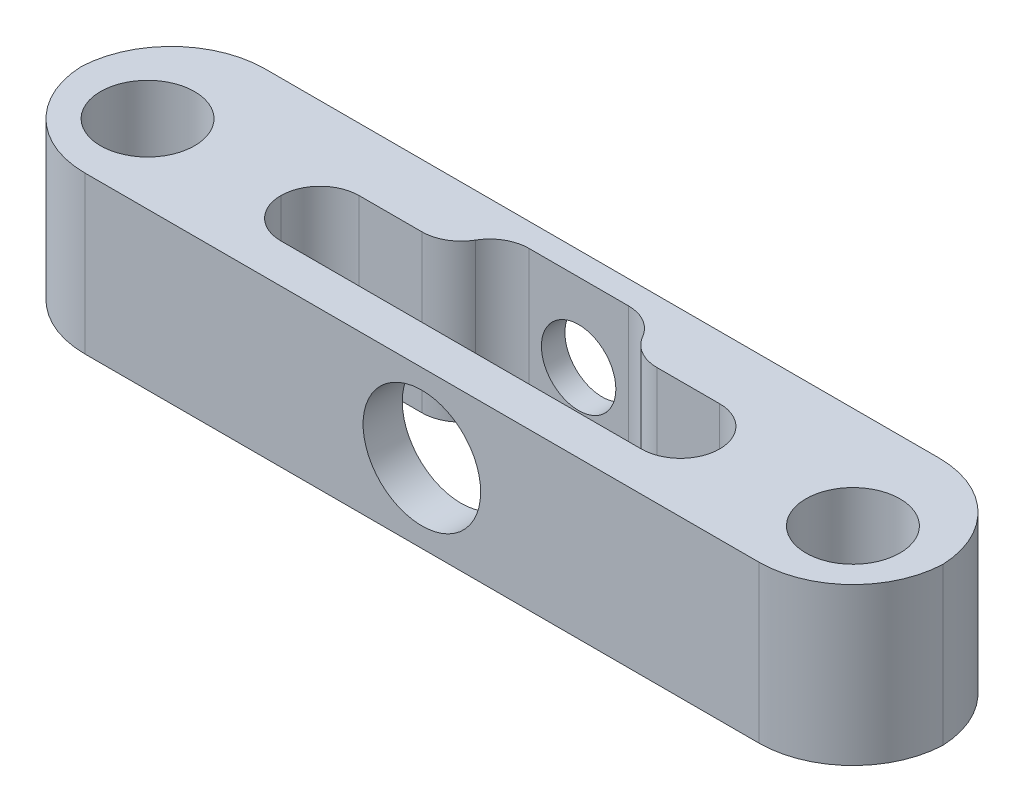
ISO-10303-21;
HEADER;
FILE_DESCRIPTION(('STEP AP214'),'2;1');
FILE_NAME('part.step','',(''),(''),'','','');
FILE_SCHEMA(('AUTOMOTIVE_DESIGN { 1 0 10303 214 1 1 1 1 }'));
ENDSEC;
DATA;
#1=APPLICATION_CONTEXT('core data for automotive mechanical design processes');
#2=APPLICATION_PROTOCOL_DEFINITION('international standard','automotive_design',2000,#1);
#3=PRODUCT_CONTEXT('',#1,'mechanical');
#4=PRODUCT('Part','Part','',(#3));
#5=PRODUCT_RELATED_PRODUCT_CATEGORY('part','',(#4));
#6=PRODUCT_DEFINITION_FORMATION('','',#4);
#7=PRODUCT_DEFINITION_CONTEXT('part definition',#1,'design');
#8=PRODUCT_DEFINITION('design','',#6,#7);
#9=PRODUCT_DEFINITION_SHAPE('','',#8);
#10=(LENGTH_UNIT() NAMED_UNIT(*) SI_UNIT(.MILLI.,.METRE.));
#11=(NAMED_UNIT(*) PLANE_ANGLE_UNIT() SI_UNIT($,.RADIAN.));
#12=(NAMED_UNIT(*) SI_UNIT($,.STERADIAN.) SOLID_ANGLE_UNIT());
#13=UNCERTAINTY_MEASURE_WITH_UNIT(LENGTH_MEASURE(1.E-05),#10,'distance_accuracy_value','');
#14=(GEOMETRIC_REPRESENTATION_CONTEXT(3) GLOBAL_UNCERTAINTY_ASSIGNED_CONTEXT((#13)) GLOBAL_UNIT_ASSIGNED_CONTEXT((#10,
#11,#12)) REPRESENTATION_CONTEXT('',''));
#15=CARTESIAN_POINT('',(0.,0.,0.));
#16=DIRECTION('',(0.,0.,1.));
#17=DIRECTION('',(1.,0.,0.));
#18=AXIS2_PLACEMENT_3D('',#15,#16,#17);
#19=CARTESIAN_POINT('',(-55.,20.,0.));
#20=DIRECTION('',(0.,-1.,0.));
#21=DIRECTION('',(0.,0.,-1.));
#22=AXIS2_PLACEMENT_3D('',#19,#20,#21);
#23=PLANE('',#22);
#24=CARTESIAN_POINT('',(-45.,20.,-10.));
#25=DIRECTION('',(0.,-1.,0.));
#26=DIRECTION('',(0.,0.,-1.));
#27=AXIS2_PLACEMENT_3D('',#24,#25,#26);
#28=CIRCLE('',#27,5.99999999999999);
#29=CARTESIAN_POINT('',(-45.,20.,-16.));
#30=VERTEX_POINT('',#29);
#31=EDGE_CURVE('E333',#30,#30,#28,.F.);
#32=ORIENTED_EDGE('',*,*,#31,.F.);
#33=EDGE_LOOP('',(#32));
#34=FACE_BOUND('',#33,.T.);
#35=CARTESIAN_POINT('',(45.,20.,-10.));
#36=DIRECTION('',(0.,-1.,0.));
#37=DIRECTION('',(0.,0.,-1.));
#38=AXIS2_PLACEMENT_3D('',#35,#36,#37);
#39=CIRCLE('',#38,5.99999999999999);
#40=CARTESIAN_POINT('',(45.,20.,-16.));
#41=VERTEX_POINT('',#40);
#42=EDGE_CURVE('E327',#41,#41,#39,.F.);
#43=ORIENTED_EDGE('',*,*,#42,.F.);
#44=EDGE_LOOP('',(#43));
#45=FACE_BOUND('',#44,.T.);
#46=CARTESIAN_POINT('',(43.,20.,-12.));
#47=DIRECTION('',(0.,-1.,0.));
#48=DIRECTION('',(0.,0.,-1.));
#49=AXIS2_PLACEMENT_3D('',#46,#47,#48);
#50=CIRCLE('',#49,12.);
#51=CARTESIAN_POINT('',(43.,20.,0.));
#52=VERTEX_POINT('',#51);
#53=CARTESIAN_POINT('',(54.9895788082818,20.,-11.5000000000001));
#54=VERTEX_POINT('',#53);
#55=EDGE_CURVE('E48',#52,#54,#50,.F.);
#56=ORIENTED_EDGE('',*,*,#55,.T.);
#57=CARTESIAN_POINT('',(43.,20.,-11.));
#58=DIRECTION('',(0.,-1.,0.));
#59=DIRECTION('',(0.,0.,-1.));
#60=AXIS2_PLACEMENT_3D('',#57,#58,#59);
#61=CIRCLE('',#60,12.);
#62=CARTESIAN_POINT('',(43.,20.,-23.));
#63=VERTEX_POINT('',#62);
#64=EDGE_CURVE('E239',#54,#63,#61,.F.);
#65=ORIENTED_EDGE('',*,*,#64,.T.);
#66=DIRECTION('',(-1.,0.,0.));
#67=VECTOR('',#66,1.);
#68=CARTESIAN_POINT('',(-55.,20.,-23.));
#69=LINE('',#68,#67);
#70=CARTESIAN_POINT('',(-43.,20.,-23.));
#71=VERTEX_POINT('',#70);
#72=EDGE_CURVE('E266',#63,#71,#69,.T.);
#73=ORIENTED_EDGE('',*,*,#72,.T.);
#74=CARTESIAN_POINT('',(-43.,20.,-11.));
#75=DIRECTION('',(0.,-1.,0.));
#76=DIRECTION('',(0.,0.,-1.));
#77=AXIS2_PLACEMENT_3D('',#74,#75,#76);
#78=CIRCLE('',#77,12.);
#79=CARTESIAN_POINT('',(-54.9895788082818,20.,-11.5));
#80=VERTEX_POINT('',#79);
#81=EDGE_CURVE('E55',#71,#80,#78,.F.);
#82=ORIENTED_EDGE('',*,*,#81,.T.);
#83=CARTESIAN_POINT('',(-43.,20.,-12.));
#84=DIRECTION('',(0.,-1.,0.));
#85=DIRECTION('',(0.,0.,-1.));
#86=AXIS2_PLACEMENT_3D('',#83,#84,#85);
#87=CIRCLE('',#86,12.);
#88=CARTESIAN_POINT('',(-43.,20.,0.));
#89=VERTEX_POINT('',#88);
#90=EDGE_CURVE('E235',#80,#89,#87,.F.);
#91=ORIENTED_EDGE('',*,*,#90,.T.);
#92=DIRECTION('',(1.,0.,0.));
#93=VECTOR('',#92,1.);
#94=CARTESIAN_POINT('',(25.,20.,0.));
#95=LINE('',#94,#93);
#96=EDGE_CURVE('E260',#89,#52,#95,.T.);
#97=ORIENTED_EDGE('',*,*,#96,.T.);
#98=EDGE_LOOP('',(#56,#65,#73,#82,#91,#97));
#99=FACE_BOUND('',#98,.T.);
#100=DIRECTION('',(-1.,0.,0.));
#101=VECTOR('',#100,1.);
#102=CARTESIAN_POINT('',(-10.,20.,-15.));
#103=LINE('',#102,#101);
#104=CARTESIAN_POINT('',(-15.,20.,-15.));
#105=VERTEX_POINT('',#104);
#106=CARTESIAN_POINT('',(-23.,20.,-15.));
#107=VERTEX_POINT('',#106);
#108=EDGE_CURVE('E277',#105,#107,#103,.T.);
#109=ORIENTED_EDGE('',*,*,#108,.F.);
#110=CARTESIAN_POINT('',(-15.,20.,-20.));
#111=DIRECTION('',(0.,-1.,0.));
#112=DIRECTION('',(0.,0.,-1.));
#113=AXIS2_PLACEMENT_3D('',#110,#111,#112);
#114=CIRCLE('',#113,5.);
#115=CARTESIAN_POINT('',(-10.6698729810778,20.,-17.5));
#116=VERTEX_POINT('',#115);
#117=EDGE_CURVE('E288',#105,#116,#114,.F.);
#118=ORIENTED_EDGE('',*,*,#117,.T.);
#119=CARTESIAN_POINT('',(-6.33974596215561,20.,-15.));
#120=DIRECTION('',(0.,-1.,0.));
#121=DIRECTION('',(0.,0.,-1.));
#122=AXIS2_PLACEMENT_3D('',#119,#120,#121);
#123=CIRCLE('',#122,5.);
#124=CARTESIAN_POINT('',(-6.33974596215561,20.,-20.));
#125=VERTEX_POINT('',#124);
#126=EDGE_CURVE('E219',#116,#125,#123,.T.);
#127=ORIENTED_EDGE('',*,*,#126,.T.);
#128=DIRECTION('',(-1.,0.,0.));
#129=VECTOR('',#128,1.);
#130=CARTESIAN_POINT('',(10.,20.,-20.));
#131=LINE('',#130,#129);
#132=CARTESIAN_POINT('',(6.33974596215562,20.,-20.));
#133=VERTEX_POINT('',#132);
#134=EDGE_CURVE('E315',#133,#125,#131,.T.);
#135=ORIENTED_EDGE('',*,*,#134,.F.);
#136=CARTESIAN_POINT('',(6.33974596215562,20.,-15.));
#137=DIRECTION('',(0.,-1.,0.));
#138=DIRECTION('',(0.,0.,-1.));
#139=AXIS2_PLACEMENT_3D('',#136,#137,#138);
#140=CIRCLE('',#139,5.);
#141=CARTESIAN_POINT('',(10.6698729810778,20.,-17.5));
#142=VERTEX_POINT('',#141);
#143=EDGE_CURVE('E215',#133,#142,#140,.T.);
#144=ORIENTED_EDGE('',*,*,#143,.T.);
#145=CARTESIAN_POINT('',(15.,20.,-20.));
#146=DIRECTION('',(0.,-1.,0.));
#147=DIRECTION('',(0.,0.,-1.));
#148=AXIS2_PLACEMENT_3D('',#145,#146,#147);
#149=CIRCLE('',#148,5.);
#150=CARTESIAN_POINT('',(15.,20.,-15.));
#151=VERTEX_POINT('',#150);
#152=EDGE_CURVE('E286',#142,#151,#149,.F.);
#153=ORIENTED_EDGE('',*,*,#152,.T.);
#154=DIRECTION('',(-1.,0.,0.));
#155=VECTOR('',#154,1.);
#156=CARTESIAN_POINT('',(28.,20.,-15.));
#157=LINE('',#156,#155);
#158=CARTESIAN_POINT('',(23.,20.,-15.));
#159=VERTEX_POINT('',#158);
#160=EDGE_CURVE('E302',#159,#151,#157,.T.);
#161=ORIENTED_EDGE('',*,*,#160,.F.);
#162=CARTESIAN_POINT('',(23.,20.,-9.99999999999999));
#163=DIRECTION('',(0.,-1.,0.));
#164=DIRECTION('',(0.,0.,-1.));
#165=AXIS2_PLACEMENT_3D('',#162,#163,#164);
#166=CIRCLE('',#165,5.);
#167=CARTESIAN_POINT('',(28.,20.,-9.99999999999999));
#168=VERTEX_POINT('',#167);
#169=EDGE_CURVE('E179',#159,#168,#166,.T.);
#170=ORIENTED_EDGE('',*,*,#169,.T.);
#171=CARTESIAN_POINT('',(23.,20.,-9.99999999999999));
#172=DIRECTION('',(0.,-1.,0.));
#173=DIRECTION('',(0.,0.,-1.));
#174=AXIS2_PLACEMENT_3D('',#171,#172,#173);
#175=CIRCLE('',#174,5.);
#176=CARTESIAN_POINT('',(23.,20.,-4.99999999999999));
#177=VERTEX_POINT('',#176);
#178=EDGE_CURVE('E201',#168,#177,#175,.T.);
#179=ORIENTED_EDGE('',*,*,#178,.T.);
#180=DIRECTION('',(1.,0.,0.));
#181=VECTOR('',#180,1.);
#182=CARTESIAN_POINT('',(-28.,20.,-4.99999999999999));
#183=LINE('',#182,#181);
#184=CARTESIAN_POINT('',(-23.,20.,-4.99999999999999));
#185=VERTEX_POINT('',#184);
#186=EDGE_CURVE('E319',#185,#177,#183,.T.);
#187=ORIENTED_EDGE('',*,*,#186,.F.);
#188=CARTESIAN_POINT('',(-23.,20.,-9.99999999999999));
#189=DIRECTION('',(0.,-1.,0.));
#190=DIRECTION('',(0.,0.,-1.));
#191=AXIS2_PLACEMENT_3D('',#188,#189,#190);
#192=CIRCLE('',#191,5.);
#193=CARTESIAN_POINT('',(-28.,20.,-9.99999999999998));
#194=VERTEX_POINT('',#193);
#195=EDGE_CURVE('E167',#185,#194,#192,.T.);
#196=ORIENTED_EDGE('',*,*,#195,.T.);
#197=CARTESIAN_POINT('',(-23.,20.,-9.99999999999998));
#198=DIRECTION('',(0.,-1.,0.));
#199=DIRECTION('',(0.,0.,-1.));
#200=AXIS2_PLACEMENT_3D('',#197,#198,#199);
#201=CIRCLE('',#200,5.);
#202=EDGE_CURVE('E178',#194,#107,#201,.T.);
#203=ORIENTED_EDGE('',*,*,#202,.T.);
#204=EDGE_LOOP('',(#109,#118,#127,#135,#144,#153,#161,#170,#179,#187,#196,#203));
#205=FACE_BOUND('',#204,.T.);
#206=ADVANCED_FACE('F31',(#34,#45,#99,#205),#23,.F.);
#207=CARTESIAN_POINT('',(-55.,0.,0.));
#208=DIRECTION('',(0.,-1.,0.));
#209=DIRECTION('',(0.,0.,-1.));
#210=AXIS2_PLACEMENT_3D('',#207,#208,#209);
#211=PLANE('',#210);
#212=CARTESIAN_POINT('',(-45.,0.,-10.));
#213=DIRECTION('',(0.,-1.,0.));
#214=DIRECTION('',(0.,0.,-1.));
#215=AXIS2_PLACEMENT_3D('',#212,#213,#214);
#216=CIRCLE('',#215,5.99999999999999);
#217=CARTESIAN_POINT('',(-45.,0.,-16.));
#218=VERTEX_POINT('',#217);
#219=EDGE_CURVE('E336',#218,#218,#216,.T.);
#220=ORIENTED_EDGE('',*,*,#219,.F.);
#221=EDGE_LOOP('',(#220));
#222=FACE_BOUND('',#221,.T.);
#223=CARTESIAN_POINT('',(45.,0.,-10.));
#224=DIRECTION('',(0.,-1.,0.));
#225=DIRECTION('',(0.,0.,-1.));
#226=AXIS2_PLACEMENT_3D('',#223,#224,#225);
#227=CIRCLE('',#226,5.99999999999999);
#228=CARTESIAN_POINT('',(45.,0.,-16.));
#229=VERTEX_POINT('',#228);
#230=EDGE_CURVE('E330',#229,#229,#227,.T.);
#231=ORIENTED_EDGE('',*,*,#230,.F.);
#232=EDGE_LOOP('',(#231));
#233=FACE_BOUND('',#232,.T.);
#234=DIRECTION('',(-1.,0.,0.));
#235=VECTOR('',#234,1.);
#236=CARTESIAN_POINT('',(-55.,0.,-23.));
#237=LINE('',#236,#235);
#238=CARTESIAN_POINT('',(43.,0.,-23.));
#239=VERTEX_POINT('',#238);
#240=CARTESIAN_POINT('',(-43.,0.,-23.));
#241=VERTEX_POINT('',#240);
#242=EDGE_CURVE('E271',#239,#241,#237,.T.);
#243=ORIENTED_EDGE('',*,*,#242,.F.);
#244=CARTESIAN_POINT('',(43.,0.,-11.));
#245=DIRECTION('',(0.,-1.,0.));
#246=DIRECTION('',(0.,0.,-1.));
#247=AXIS2_PLACEMENT_3D('',#244,#245,#246);
#248=CIRCLE('',#247,12.);
#249=CARTESIAN_POINT('',(54.9895788082818,0.,-11.5000000000001));
#250=VERTEX_POINT('',#249);
#251=EDGE_CURVE('E233',#239,#250,#248,.T.);
#252=ORIENTED_EDGE('',*,*,#251,.T.);
#253=CARTESIAN_POINT('',(43.,0.,-12.));
#254=DIRECTION('',(0.,-1.,0.));
#255=DIRECTION('',(0.,0.,-1.));
#256=AXIS2_PLACEMENT_3D('',#253,#254,#255);
#257=CIRCLE('',#256,12.);
#258=CARTESIAN_POINT('',(43.,0.,0.));
#259=VERTEX_POINT('',#258);
#260=EDGE_CURVE('E231',#250,#259,#257,.T.);
#261=ORIENTED_EDGE('',*,*,#260,.T.);
#262=DIRECTION('',(1.,0.,0.));
#263=VECTOR('',#262,1.);
#264=CARTESIAN_POINT('',(-30.,0.,0.));
#265=LINE('',#264,#263);
#266=CARTESIAN_POINT('',(-43.,0.,0.));
#267=VERTEX_POINT('',#266);
#268=EDGE_CURVE('E267',#267,#259,#265,.T.);
#269=ORIENTED_EDGE('',*,*,#268,.F.);
#270=CARTESIAN_POINT('',(-43.,0.,-12.));
#271=DIRECTION('',(0.,-1.,0.));
#272=DIRECTION('',(0.,0.,-1.));
#273=AXIS2_PLACEMENT_3D('',#270,#271,#272);
#274=CIRCLE('',#273,12.);
#275=CARTESIAN_POINT('',(-54.9895788082818,0.,-11.5));
#276=VERTEX_POINT('',#275);
#277=EDGE_CURVE('E227',#267,#276,#274,.T.);
#278=ORIENTED_EDGE('',*,*,#277,.T.);
#279=CARTESIAN_POINT('',(-43.,0.,-11.));
#280=DIRECTION('',(0.,-1.,0.));
#281=DIRECTION('',(0.,0.,-1.));
#282=AXIS2_PLACEMENT_3D('',#279,#280,#281);
#283=CIRCLE('',#282,12.);
#284=EDGE_CURVE('E229',#276,#241,#283,.T.);
#285=ORIENTED_EDGE('',*,*,#284,.T.);
#286=EDGE_LOOP('',(#243,#252,#261,#269,#278,#285));
#287=FACE_BOUND('',#286,.T.);
#288=CARTESIAN_POINT('',(15.,0.,-20.));
#289=DIRECTION('',(0.,-1.,0.));
#290=DIRECTION('',(0.,0.,-1.));
#291=AXIS2_PLACEMENT_3D('',#288,#289,#290);
#292=CIRCLE('',#291,5.);
#293=CARTESIAN_POINT('',(15.,0.,-15.));
#294=VERTEX_POINT('',#293);
#295=CARTESIAN_POINT('',(10.6698729810778,0.,-17.5));
#296=VERTEX_POINT('',#295);
#297=EDGE_CURVE('E269',#294,#296,#292,.T.);
#298=ORIENTED_EDGE('',*,*,#297,.T.);
#299=CARTESIAN_POINT('',(6.33974596215562,0.,-15.));
#300=DIRECTION('',(0.,-1.,0.));
#301=DIRECTION('',(0.,0.,-1.));
#302=AXIS2_PLACEMENT_3D('',#299,#300,#301);
#303=CIRCLE('',#302,5.);
#304=CARTESIAN_POINT('',(6.33974596215562,0.,-20.));
#305=VERTEX_POINT('',#304);
#306=EDGE_CURVE('E213',#296,#305,#303,.F.);
#307=ORIENTED_EDGE('',*,*,#306,.T.);
#308=DIRECTION('',(-1.,0.,0.));
#309=VECTOR('',#308,1.);
#310=CARTESIAN_POINT('',(10.,0.,-20.));
#311=LINE('',#310,#309);
#312=CARTESIAN_POINT('',(-6.33974596215561,0.,-20.));
#313=VERTEX_POINT('',#312);
#314=EDGE_CURVE('E306',#305,#313,#311,.T.);
#315=ORIENTED_EDGE('',*,*,#314,.T.);
#316=CARTESIAN_POINT('',(-6.33974596215561,0.,-15.));
#317=DIRECTION('',(0.,-1.,0.));
#318=DIRECTION('',(0.,0.,-1.));
#319=AXIS2_PLACEMENT_3D('',#316,#317,#318);
#320=CIRCLE('',#319,5.);
#321=CARTESIAN_POINT('',(-10.6698729810778,0.,-17.5));
#322=VERTEX_POINT('',#321);
#323=EDGE_CURVE('E217',#313,#322,#320,.F.);
#324=ORIENTED_EDGE('',*,*,#323,.T.);
#325=CARTESIAN_POINT('',(-15.,0.,-20.));
#326=DIRECTION('',(0.,-1.,0.));
#327=DIRECTION('',(0.,0.,-1.));
#328=AXIS2_PLACEMENT_3D('',#325,#326,#327);
#329=CIRCLE('',#328,5.);
#330=CARTESIAN_POINT('',(-15.,0.,-15.));
#331=VERTEX_POINT('',#330);
#332=EDGE_CURVE('E280',#322,#331,#329,.T.);
#333=ORIENTED_EDGE('',*,*,#332,.T.);
#334=DIRECTION('',(-1.,0.,0.));
#335=VECTOR('',#334,1.);
#336=CARTESIAN_POINT('',(-10.,0.,-15.));
#337=LINE('',#336,#335);
#338=CARTESIAN_POINT('',(-23.,0.,-15.));
#339=VERTEX_POINT('',#338);
#340=EDGE_CURVE('E174',#331,#339,#337,.T.);
#341=ORIENTED_EDGE('',*,*,#340,.T.);
#342=CARTESIAN_POINT('',(-23.,0.,-9.99999999999998));
#343=DIRECTION('',(0.,-1.,0.));
#344=DIRECTION('',(0.,0.,-1.));
#345=AXIS2_PLACEMENT_3D('',#342,#343,#344);
#346=CIRCLE('',#345,5.);
#347=CARTESIAN_POINT('',(-28.,0.,-9.99999999999998));
#348=VERTEX_POINT('',#347);
#349=EDGE_CURVE('E170',#339,#348,#346,.F.);
#350=ORIENTED_EDGE('',*,*,#349,.T.);
#351=CARTESIAN_POINT('',(-23.,0.,-9.99999999999999));
#352=DIRECTION('',(0.,-1.,0.));
#353=DIRECTION('',(0.,0.,-1.));
#354=AXIS2_PLACEMENT_3D('',#351,#352,#353);
#355=CIRCLE('',#354,5.);
#356=CARTESIAN_POINT('',(-23.,0.,-4.99999999999999));
#357=VERTEX_POINT('',#356);
#358=EDGE_CURVE('E157',#348,#357,#355,.F.);
#359=ORIENTED_EDGE('',*,*,#358,.T.);
#360=DIRECTION('',(1.,0.,0.));
#361=VECTOR('',#360,1.);
#362=CARTESIAN_POINT('',(-28.,0.,-4.99999999999999));
#363=LINE('',#362,#361);
#364=CARTESIAN_POINT('',(23.,0.,-4.99999999999999));
#365=VERTEX_POINT('',#364);
#366=EDGE_CURVE('E307',#357,#365,#363,.T.);
#367=ORIENTED_EDGE('',*,*,#366,.T.);
#368=CARTESIAN_POINT('',(23.,0.,-9.99999999999999));
#369=DIRECTION('',(0.,-1.,0.));
#370=DIRECTION('',(0.,0.,-1.));
#371=AXIS2_PLACEMENT_3D('',#368,#369,#370);
#372=CIRCLE('',#371,5.);
#373=CARTESIAN_POINT('',(28.,0.,-9.99999999999999));
#374=VERTEX_POINT('',#373);
#375=EDGE_CURVE('E199',#365,#374,#372,.F.);
#376=ORIENTED_EDGE('',*,*,#375,.T.);
#377=CARTESIAN_POINT('',(23.,0.,-9.99999999999999));
#378=DIRECTION('',(0.,-1.,0.));
#379=DIRECTION('',(0.,0.,-1.));
#380=AXIS2_PLACEMENT_3D('',#377,#378,#379);
#381=CIRCLE('',#380,5.);
#382=CARTESIAN_POINT('',(23.,0.,-15.));
#383=VERTEX_POINT('',#382);
#384=EDGE_CURVE('E183',#374,#383,#381,.F.);
#385=ORIENTED_EDGE('',*,*,#384,.T.);
#386=DIRECTION('',(-1.,0.,0.));
#387=VECTOR('',#386,1.);
#388=CARTESIAN_POINT('',(28.,0.,-15.));
#389=LINE('',#388,#387);
#390=EDGE_CURVE('E299',#383,#294,#389,.T.);
#391=ORIENTED_EDGE('',*,*,#390,.T.);
#392=EDGE_LOOP('',(#298,#307,#315,#324,#333,#341,#350,#359,#367,#376,#385,#391));
#393=FACE_BOUND('',#392,.T.);
#394=ADVANCED_FACE('F172',(#222,#233,#287,#393),#211,.T.);
#395=CARTESIAN_POINT('',(-55.,20.,-23.));
#396=DIRECTION('',(0.,0.,1.));
#397=DIRECTION('',(1.,0.,0.));
#398=AXIS2_PLACEMENT_3D('',#395,#396,#397);
#399=PLANE('',#398);
#400=CARTESIAN_POINT('',(0.,10.,-23.));
#401=DIRECTION('',(0.,0.,1.));
#402=DIRECTION('',(1.,0.,0.));
#403=AXIS2_PLACEMENT_3D('',#400,#401,#402);
#404=CIRCLE('',#403,4.75);
#405=CARTESIAN_POINT('',(4.75,10.,-23.));
#406=VERTEX_POINT('',#405);
#407=EDGE_CURVE('E310',#406,#406,#404,.F.);
#408=ORIENTED_EDGE('',*,*,#407,.F.);
#409=EDGE_LOOP('',(#408));
#410=FACE_BOUND('',#409,.T.);
#411=ORIENTED_EDGE('',*,*,#72,.F.);
#412=DIRECTION('',(0.,-1.,0.));
#413=VECTOR('',#412,1.);
#414=CARTESIAN_POINT('',(43.,20.,-23.));
#415=LINE('',#414,#413);
#416=EDGE_CURVE('E224',#63,#239,#415,.T.);
#417=ORIENTED_EDGE('',*,*,#416,.T.);
#418=ORIENTED_EDGE('',*,*,#242,.T.);
#419=DIRECTION('',(0.,-1.,0.));
#420=VECTOR('',#419,1.);
#421=CARTESIAN_POINT('',(-43.,20.,-23.));
#422=LINE('',#421,#420);
#423=EDGE_CURVE('E221',#241,#71,#422,.F.);
#424=ORIENTED_EDGE('',*,*,#423,.T.);
#425=EDGE_LOOP('',(#411,#417,#418,#424));
#426=FACE_BOUND('',#425,.T.);
#427=ADVANCED_FACE('F346',(#410,#426),#399,.F.);
#428=CARTESIAN_POINT('',(-30.,20.,0.));
#429=DIRECTION('',(0.,0.,-1.));
#430=DIRECTION('',(-1.,0.,0.));
#431=AXIS2_PLACEMENT_3D('',#428,#429,#430);
#432=PLANE('',#431);
#433=CARTESIAN_POINT('',(0.,10.,0.));
#434=DIRECTION('',(0.,0.,1.));
#435=DIRECTION('',(1.,0.,0.));
#436=AXIS2_PLACEMENT_3D('',#433,#434,#435);
#437=CIRCLE('',#436,7.5);
#438=CARTESIAN_POINT('',(7.5,10.,0.));
#439=VERTEX_POINT('',#438);
#440=EDGE_CURVE('E247',#439,#439,#437,.T.);
#441=ORIENTED_EDGE('',*,*,#440,.F.);
#442=EDGE_LOOP('',(#441));
#443=FACE_BOUND('',#442,.T.);
#444=ORIENTED_EDGE('',*,*,#268,.T.);
#445=DIRECTION('',(0.,-1.,0.));
#446=VECTOR('',#445,1.);
#447=CARTESIAN_POINT('',(43.,20.,0.));
#448=LINE('',#447,#446);
#449=EDGE_CURVE('E11',#259,#52,#448,.F.);
#450=ORIENTED_EDGE('',*,*,#449,.T.);
#451=ORIENTED_EDGE('',*,*,#96,.F.);
#452=DIRECTION('',(0.,-1.,0.));
#453=VECTOR('',#452,1.);
#454=CARTESIAN_POINT('',(-43.,20.,0.));
#455=LINE('',#454,#453);
#456=EDGE_CURVE('E40',#89,#267,#455,.T.);
#457=ORIENTED_EDGE('',*,*,#456,.T.);
#458=EDGE_LOOP('',(#444,#450,#451,#457));
#459=FACE_BOUND('',#458,.T.);
#460=ADVANCED_FACE('F263',(#443,#459),#432,.F.);
#461=CARTESIAN_POINT('',(-28.,20.,-4.99999999999999));
#462=DIRECTION('',(0.,0.,-1.));
#463=DIRECTION('',(-1.,0.,0.));
#464=AXIS2_PLACEMENT_3D('',#461,#462,#463);
#465=PLANE('',#464);
#466=CARTESIAN_POINT('',(0.,10.,-4.99999999999999));
#467=DIRECTION('',(0.,0.,-1.));
#468=DIRECTION('',(-1.,0.,0.));
#469=AXIS2_PLACEMENT_3D('',#466,#467,#468);
#470=CIRCLE('',#469,7.5);
#471=CARTESIAN_POINT('',(-7.5,10.,-4.99999999999999));
#472=VERTEX_POINT('',#471);
#473=EDGE_CURVE('E243',#472,#472,#470,.F.);
#474=ORIENTED_EDGE('',*,*,#473,.T.);
#475=EDGE_LOOP('',(#474));
#476=FACE_BOUND('',#475,.T.);
#477=ORIENTED_EDGE('',*,*,#366,.F.);
#478=DIRECTION('',(0.,-1.,0.));
#479=VECTOR('',#478,1.);
#480=CARTESIAN_POINT('',(-23.,20.,-4.99999999999999));
#481=LINE('',#480,#479);
#482=EDGE_CURVE('E163',#357,#185,#481,.F.);
#483=ORIENTED_EDGE('',*,*,#482,.T.);
#484=ORIENTED_EDGE('',*,*,#186,.T.);
#485=DIRECTION('',(0.,-1.,0.));
#486=VECTOR('',#485,1.);
#487=CARTESIAN_POINT('',(23.,0.,-4.99999999999999));
#488=LINE('',#487,#486);
#489=EDGE_CURVE('E194',#177,#365,#488,.T.);
#490=ORIENTED_EDGE('',*,*,#489,.T.);
#491=EDGE_LOOP('',(#477,#483,#484,#490));
#492=FACE_BOUND('',#491,.T.);
#493=ADVANCED_FACE('F345',(#476,#492),#465,.T.);
#494=CARTESIAN_POINT('',(28.,20.,-15.));
#495=DIRECTION('',(0.,0.,1.));
#496=DIRECTION('',(1.,0.,0.));
#497=AXIS2_PLACEMENT_3D('',#494,#495,#496);
#498=PLANE('',#497);
#499=ORIENTED_EDGE('',*,*,#160,.T.);
#500=DIRECTION('',(0.,-1.,0.));
#501=VECTOR('',#500,1.);
#502=CARTESIAN_POINT('',(15.,20.,-15.));
#503=LINE('',#502,#501);
#504=EDGE_CURVE('E188',#151,#294,#503,.T.);
#505=ORIENTED_EDGE('',*,*,#504,.T.);
#506=ORIENTED_EDGE('',*,*,#390,.F.);
#507=DIRECTION('',(0.,-1.,0.));
#508=VECTOR('',#507,1.);
#509=CARTESIAN_POINT('',(23.,20.,-15.));
#510=LINE('',#509,#508);
#511=EDGE_CURVE('E291',#383,#159,#510,.F.);
#512=ORIENTED_EDGE('',*,*,#511,.T.);
#513=EDGE_LOOP('',(#499,#505,#506,#512));
#514=FACE_BOUND('',#513,.T.);
#515=ADVANCED_FACE('F298',(#514),#498,.T.);
#516=CARTESIAN_POINT('',(10.,20.,-20.));
#517=DIRECTION('',(0.,0.,1.));
#518=DIRECTION('',(1.,0.,0.));
#519=AXIS2_PLACEMENT_3D('',#516,#517,#518);
#520=PLANE('',#519);
#521=CARTESIAN_POINT('',(0.,10.,-20.));
#522=DIRECTION('',(0.,0.,1.));
#523=DIRECTION('',(1.,0.,0.));
#524=AXIS2_PLACEMENT_3D('',#521,#522,#523);
#525=CIRCLE('',#524,4.75);
#526=CARTESIAN_POINT('',(4.75,10.,-20.));
#527=VERTEX_POINT('',#526);
#528=EDGE_CURVE('E324',#527,#527,#525,.T.);
#529=ORIENTED_EDGE('',*,*,#528,.F.);
#530=EDGE_LOOP('',(#529));
#531=FACE_BOUND('',#530,.T.);
#532=ORIENTED_EDGE('',*,*,#314,.F.);
#533=DIRECTION('',(0.,1.,0.));
#534=VECTOR('',#533,1.);
#535=CARTESIAN_POINT('',(6.33974596215562,20.,-20.));
#536=LINE('',#535,#534);
#537=EDGE_CURVE('E209',#305,#133,#536,.T.);
#538=ORIENTED_EDGE('',*,*,#537,.T.);
#539=ORIENTED_EDGE('',*,*,#134,.T.);
#540=DIRECTION('',(0.,1.,0.));
#541=VECTOR('',#540,1.);
#542=CARTESIAN_POINT('',(-6.33974596215561,0.,-20.));
#543=LINE('',#542,#541);
#544=EDGE_CURVE('E206',#125,#313,#543,.F.);
#545=ORIENTED_EDGE('',*,*,#544,.T.);
#546=EDGE_LOOP('',(#532,#538,#539,#545));
#547=FACE_BOUND('',#546,.T.);
#548=ADVANCED_FACE('F369',(#531,#547),#520,.T.);
#549=CARTESIAN_POINT('',(-10.,20.,-15.));
#550=DIRECTION('',(0.,0.,1.));
#551=DIRECTION('',(1.,0.,0.));
#552=AXIS2_PLACEMENT_3D('',#549,#550,#551);
#553=PLANE('',#552);
#554=ORIENTED_EDGE('',*,*,#340,.F.);
#555=DIRECTION('',(0.,-1.,0.));
#556=VECTOR('',#555,1.);
#557=CARTESIAN_POINT('',(-15.,20.,-15.));
#558=LINE('',#557,#556);
#559=EDGE_CURVE('E284',#331,#105,#558,.F.);
#560=ORIENTED_EDGE('',*,*,#559,.T.);
#561=ORIENTED_EDGE('',*,*,#108,.T.);
#562=DIRECTION('',(0.,-1.,0.));
#563=VECTOR('',#562,1.);
#564=CARTESIAN_POINT('',(-23.,0.,-15.));
#565=LINE('',#564,#563);
#566=EDGE_CURVE('E282',#107,#339,#565,.T.);
#567=ORIENTED_EDGE('',*,*,#566,.T.);
#568=EDGE_LOOP('',(#554,#560,#561,#567));
#569=FACE_BOUND('',#568,.T.);
#570=ADVANCED_FACE('F372',(#569),#553,.T.);
#571=CARTESIAN_POINT('',(0.,10.,-23.001));
#572=DIRECTION('',(0.,0.,1.));
#573=DIRECTION('',(1.,0.,0.));
#574=AXIS2_PLACEMENT_3D('',#571,#572,#573);
#575=CYLINDRICAL_SURFACE('',#574,4.75);
#576=CARTESIAN_POINT('',(4.75,10.,-20.));
#577=CARTESIAN_POINT('',(4.75,10.,-20.03125));
#578=CARTESIAN_POINT('',(4.75,10.,-20.0625));
#579=CARTESIAN_POINT('',(4.75,10.,-20.125));
#580=CARTESIAN_POINT('',(4.75,10.,-20.15625));
#581=CARTESIAN_POINT('',(4.75,10.,-20.21875));
#582=CARTESIAN_POINT('',(4.75,10.,-20.25));
#583=CARTESIAN_POINT('',(4.75,10.,-20.3125));
#584=CARTESIAN_POINT('',(4.75,10.,-20.34375));
#585=CARTESIAN_POINT('',(4.75,10.,-20.40625));
#586=CARTESIAN_POINT('',(4.75,10.,-20.4375));
#587=CARTESIAN_POINT('',(4.75,10.,-20.5));
#588=CARTESIAN_POINT('',(4.75,10.,-20.53125));
#589=CARTESIAN_POINT('',(4.75,10.,-20.59375));
#590=CARTESIAN_POINT('',(4.75,10.,-20.625));
#591=CARTESIAN_POINT('',(4.75,10.,-20.6875));
#592=CARTESIAN_POINT('',(4.75,10.,-20.71875));
#593=CARTESIAN_POINT('',(4.75,10.,-20.78125));
#594=CARTESIAN_POINT('',(4.75,10.,-20.8125));
#595=CARTESIAN_POINT('',(4.75,10.,-20.875));
#596=CARTESIAN_POINT('',(4.75,10.,-20.90625));
#597=CARTESIAN_POINT('',(4.75,10.,-20.96875));
#598=CARTESIAN_POINT('',(4.75,10.,-21.));
#599=CARTESIAN_POINT('',(4.75,10.,-21.0625));
#600=CARTESIAN_POINT('',(4.75,10.,-21.09375));
#601=CARTESIAN_POINT('',(4.75,10.,-21.15625));
#602=CARTESIAN_POINT('',(4.75,10.,-21.1875));
#603=CARTESIAN_POINT('',(4.75,10.,-21.25));
#604=CARTESIAN_POINT('',(4.75,10.,-21.28125));
#605=CARTESIAN_POINT('',(4.75,10.,-21.34375));
#606=CARTESIAN_POINT('',(4.75,10.,-21.375));
#607=CARTESIAN_POINT('',(4.75,10.,-21.4375));
#608=CARTESIAN_POINT('',(4.75,10.,-21.46875));
#609=CARTESIAN_POINT('',(4.75,10.,-21.53125));
#610=CARTESIAN_POINT('',(4.75,10.,-21.5625));
#611=CARTESIAN_POINT('',(4.75,10.,-21.625));
#612=CARTESIAN_POINT('',(4.75,10.,-21.65625));
#613=CARTESIAN_POINT('',(4.75,10.,-21.71875));
#614=CARTESIAN_POINT('',(4.75,10.,-21.75));
#615=CARTESIAN_POINT('',(4.75,10.,-21.8125));
#616=CARTESIAN_POINT('',(4.75,10.,-21.84375));
#617=CARTESIAN_POINT('',(4.75,10.,-21.90625));
#618=CARTESIAN_POINT('',(4.75,10.,-21.9375));
#619=CARTESIAN_POINT('',(4.75,10.,-22.));
#620=CARTESIAN_POINT('',(4.75,10.,-22.03125));
#621=CARTESIAN_POINT('',(4.75,10.,-22.09375));
#622=CARTESIAN_POINT('',(4.75,10.,-22.125));
#623=CARTESIAN_POINT('',(4.75,10.,-22.1875));
#624=CARTESIAN_POINT('',(4.75,10.,-22.21875));
#625=CARTESIAN_POINT('',(4.75,10.,-22.28125));
#626=CARTESIAN_POINT('',(4.75,10.,-22.3125));
#627=CARTESIAN_POINT('',(4.75,10.,-22.375));
#628=CARTESIAN_POINT('',(4.75,10.,-22.40625));
#629=CARTESIAN_POINT('',(4.75,10.,-22.46875));
#630=CARTESIAN_POINT('',(4.75,10.,-22.5));
#631=CARTESIAN_POINT('',(4.75,10.,-22.5625));
#632=CARTESIAN_POINT('',(4.75,10.,-22.59375));
#633=CARTESIAN_POINT('',(4.75,10.,-22.65625));
#634=CARTESIAN_POINT('',(4.75,10.,-22.6875));
#635=CARTESIAN_POINT('',(4.75,10.,-22.75));
#636=CARTESIAN_POINT('',(4.75,10.,-22.78125));
#637=CARTESIAN_POINT('',(4.75,10.,-22.84375));
#638=CARTESIAN_POINT('',(4.75,10.,-22.875));
#639=CARTESIAN_POINT('',(4.75,10.,-22.9375));
#640=CARTESIAN_POINT('',(4.75,10.,-22.96875));
#641=CARTESIAN_POINT('',(4.75,10.,-23.));
#642=B_SPLINE_CURVE_WITH_KNOTS('',3,(#576,#577,#578,#579,#580,#581,#582,#583,#584,#585,#586,
#587,#588,#589,#590,#591,#592,#593,#594,#595,#596,#597,#598,#599,#600,#601,#602,#603,#604,#605,
#606,#607,#608,#609,#610,#611,#612,#613,#614,#615,#616,#617,#618,#619,#620,#621,#622,#623,#624,
#625,#626,#627,#628,#629,#630,#631,#632,#633,#634,#635,#636,#637,#638,#639,#640,#641),
.UNSPECIFIED.,.F.,.F.,(4,2,2,2,2,2,2,2,2,2,2,2,2,2,2,2,2,2,2,2,2,2,2,2,2,2,2,2,2,2,2,2,4),(0.,
0.0937500000000001,0.187500000000004,0.281250000000004,0.375000000000004,0.468750000000004,
0.562500000000004,0.656250000000004,0.750000000000004,0.843750000000004,0.937500000000004,
1.03125000000001,1.12500000000001,1.21875000000001,1.31250000000001,1.40625000000001,
1.50000000000001,1.59375000000001,1.68750000000001,1.78125000000001,1.87500000000001,
1.96875000000001,2.06250000000001,2.15625000000001,2.25000000000001,2.34375000000001,
2.43750000000001,2.53125000000001,2.62500000000001,2.71875000000001,2.81250000000001,
2.90625000000001,3.00000000000002),.UNSPECIFIED.);
#643=EDGE_CURVE('BSEAM376',#527,#406,#642,.T.);
#644=ORIENTED_EDGE('',*,*,#528,.T.);
#645=ORIENTED_EDGE('',*,*,#407,.T.);
#646=ORIENTED_EDGE('',*,*,#643,.T.);
#647=ORIENTED_EDGE('',*,*,#643,.F.);
#648=EDGE_LOOP('',(#644,#646,#645,#647));
#649=FACE_BOUND('',#648,.T.);
#650=ADVANCED_FACE('F376',(#649),#575,.F.);
#651=CARTESIAN_POINT('',(45.,20.001,-10.));
#652=DIRECTION('',(0.,-1.,0.));
#653=DIRECTION('',(0.,0.,-1.));
#654=AXIS2_PLACEMENT_3D('',#651,#652,#653);
#655=CYLINDRICAL_SURFACE('',#654,5.99999999999999);
#656=ORIENTED_EDGE('',*,*,#230,.T.);
#657=EDGE_LOOP('',(#656));
#658=FACE_BOUND('',#657,.T.);
#659=ORIENTED_EDGE('',*,*,#42,.T.);
#660=EDGE_LOOP('',(#659));
#661=FACE_BOUND('',#660,.T.);
#662=ADVANCED_FACE('F380',(#658,#661),#655,.F.);
#663=CARTESIAN_POINT('',(-45.,20.001,-10.));
#664=DIRECTION('',(0.,-1.,0.));
#665=DIRECTION('',(0.,0.,-1.));
#666=AXIS2_PLACEMENT_3D('',#663,#664,#665);
#667=CYLINDRICAL_SURFACE('',#666,5.99999999999999);
#668=ORIENTED_EDGE('',*,*,#219,.T.);
#669=EDGE_LOOP('',(#668));
#670=FACE_BOUND('',#669,.T.);
#671=ORIENTED_EDGE('',*,*,#31,.T.);
#672=EDGE_LOOP('',(#671));
#673=FACE_BOUND('',#672,.T.);
#674=ADVANCED_FACE('F384',(#670,#673),#667,.F.);
#675=CARTESIAN_POINT('',(-15.,20.,-20.));
#676=DIRECTION('',(0.,-1.,0.));
#677=DIRECTION('',(0.,0.,-1.));
#678=AXIS2_PLACEMENT_3D('',#675,#676,#677);
#679=CYLINDRICAL_SURFACE('',#678,5.);
#680=ORIENTED_EDGE('',*,*,#332,.F.);
#681=DIRECTION('',(0.,-1.,0.));
#682=VECTOR('',#681,1.);
#683=CARTESIAN_POINT('',(-10.6698729810778,20.,-17.5));
#684=LINE('',#683,#682);
#685=EDGE_CURVE('E211',#322,#116,#684,.F.);
#686=ORIENTED_EDGE('',*,*,#685,.T.);
#687=ORIENTED_EDGE('',*,*,#117,.F.);
#688=ORIENTED_EDGE('',*,*,#559,.F.);
#689=EDGE_LOOP('',(#680,#686,#687,#688));
#690=FACE_BOUND('',#689,.T.);
#691=ADVANCED_FACE('F388',(#690),#679,.T.);
#692=CARTESIAN_POINT('',(15.,20.,-20.));
#693=DIRECTION('',(0.,-1.,0.));
#694=DIRECTION('',(0.,0.,-1.));
#695=AXIS2_PLACEMENT_3D('',#692,#693,#694);
#696=CYLINDRICAL_SURFACE('',#695,5.);
#697=ORIENTED_EDGE('',*,*,#152,.F.);
#698=DIRECTION('',(0.,-1.,0.));
#699=VECTOR('',#698,1.);
#700=CARTESIAN_POINT('',(10.6698729810778,20.,-17.5));
#701=LINE('',#700,#699);
#702=EDGE_CURVE('E203',#142,#296,#701,.T.);
#703=ORIENTED_EDGE('',*,*,#702,.T.);
#704=ORIENTED_EDGE('',*,*,#297,.F.);
#705=ORIENTED_EDGE('',*,*,#504,.F.);
#706=EDGE_LOOP('',(#697,#703,#704,#705));
#707=FACE_BOUND('',#706,.T.);
#708=ADVANCED_FACE('F416',(#707),#696,.T.);
#709=CARTESIAN_POINT('',(23.,20.,-9.99999999999999));
#710=DIRECTION('',(0.,1.,0.));
#711=DIRECTION('',(0.,0.,1.));
#712=AXIS2_PLACEMENT_3D('',#709,#710,#711);
#713=CYLINDRICAL_SURFACE('',#712,5.);
#714=ORIENTED_EDGE('',*,*,#169,.F.);
#715=ORIENTED_EDGE('',*,*,#511,.F.);
#716=ORIENTED_EDGE('',*,*,#384,.F.);
#717=DIRECTION('',(0.,-1.,0.));
#718=VECTOR('',#717,1.);
#719=CARTESIAN_POINT('',(28.,0.,-9.99999999999999));
#720=LINE('',#719,#718);
#721=EDGE_CURVE('E184',#168,#374,#720,.T.);
#722=ORIENTED_EDGE('',*,*,#721,.F.);
#723=EDGE_LOOP('',(#714,#715,#716,#722));
#724=FACE_BOUND('',#723,.T.);
#725=ADVANCED_FACE('F410',(#724),#713,.F.);
#726=CARTESIAN_POINT('',(-23.,20.,-9.99999999999998));
#727=DIRECTION('',(0.,1.,0.));
#728=DIRECTION('',(0.,0.,1.));
#729=AXIS2_PLACEMENT_3D('',#726,#727,#728);
#730=CYLINDRICAL_SURFACE('',#729,5.);
#731=ORIENTED_EDGE('',*,*,#202,.F.);
#732=DIRECTION('',(0.,-1.,0.));
#733=VECTOR('',#732,1.);
#734=CARTESIAN_POINT('',(-28.,20.,-9.99999999999998));
#735=LINE('',#734,#733);
#736=EDGE_CURVE('E162',#348,#194,#735,.F.);
#737=ORIENTED_EDGE('',*,*,#736,.F.);
#738=ORIENTED_EDGE('',*,*,#349,.F.);
#739=ORIENTED_EDGE('',*,*,#566,.F.);
#740=EDGE_LOOP('',(#731,#737,#738,#739));
#741=FACE_BOUND('',#740,.T.);
#742=ADVANCED_FACE('F182',(#741),#730,.F.);
#743=CARTESIAN_POINT('',(-23.,20.,-9.99999999999999));
#744=DIRECTION('',(0.,1.,0.));
#745=DIRECTION('',(0.,0.,1.));
#746=AXIS2_PLACEMENT_3D('',#743,#744,#745);
#747=CYLINDRICAL_SURFACE('',#746,5.);
#748=ORIENTED_EDGE('',*,*,#195,.F.);
#749=ORIENTED_EDGE('',*,*,#482,.F.);
#750=ORIENTED_EDGE('',*,*,#358,.F.);
#751=ORIENTED_EDGE('',*,*,#736,.T.);
#752=EDGE_LOOP('',(#748,#749,#750,#751));
#753=FACE_BOUND('',#752,.T.);
#754=ADVANCED_FACE('F160',(#753),#747,.F.);
#755=CARTESIAN_POINT('',(23.,20.,-9.99999999999999));
#756=DIRECTION('',(0.,1.,0.));
#757=DIRECTION('',(0.,0.,1.));
#758=AXIS2_PLACEMENT_3D('',#755,#756,#757);
#759=CYLINDRICAL_SURFACE('',#758,5.);
#760=ORIENTED_EDGE('',*,*,#178,.F.);
#761=ORIENTED_EDGE('',*,*,#721,.T.);
#762=ORIENTED_EDGE('',*,*,#375,.F.);
#763=ORIENTED_EDGE('',*,*,#489,.F.);
#764=EDGE_LOOP('',(#760,#761,#762,#763));
#765=FACE_BOUND('',#764,.T.);
#766=ADVANCED_FACE('F392',(#765),#759,.F.);
#767=CARTESIAN_POINT('',(0.,10.,-23.001));
#768=DIRECTION('',(0.,0.,1.));
#769=DIRECTION('',(1.,0.,0.));
#770=AXIS2_PLACEMENT_3D('',#767,#768,#769);
#771=CYLINDRICAL_SURFACE('',#770,7.5);
#772=ORIENTED_EDGE('',*,*,#473,.F.);
#773=EDGE_LOOP('',(#772));
#774=FACE_BOUND('',#773,.T.);
#775=ORIENTED_EDGE('',*,*,#440,.T.);
#776=EDGE_LOOP('',(#775));
#777=FACE_BOUND('',#776,.T.);
#778=ADVANCED_FACE('F342',(#774,#777),#771,.F.);
#779=CARTESIAN_POINT('',(6.33974596215562,20.,-15.));
#780=DIRECTION('',(0.,-1.,0.));
#781=DIRECTION('',(0.,0.,-1.));
#782=AXIS2_PLACEMENT_3D('',#779,#780,#781);
#783=CYLINDRICAL_SURFACE('',#782,5.);
#784=ORIENTED_EDGE('',*,*,#143,.F.);
#785=ORIENTED_EDGE('',*,*,#537,.F.);
#786=ORIENTED_EDGE('',*,*,#306,.F.);
#787=ORIENTED_EDGE('',*,*,#702,.F.);
#788=EDGE_LOOP('',(#784,#785,#786,#787));
#789=FACE_BOUND('',#788,.T.);
#790=ADVANCED_FACE('F391',(#789),#783,.F.);
#791=CARTESIAN_POINT('',(-6.33974596215561,20.,-15.));
#792=DIRECTION('',(0.,-1.,0.));
#793=DIRECTION('',(0.,0.,-1.));
#794=AXIS2_PLACEMENT_3D('',#791,#792,#793);
#795=CYLINDRICAL_SURFACE('',#794,5.);
#796=ORIENTED_EDGE('',*,*,#126,.F.);
#797=ORIENTED_EDGE('',*,*,#685,.F.);
#798=ORIENTED_EDGE('',*,*,#323,.F.);
#799=ORIENTED_EDGE('',*,*,#544,.F.);
#800=EDGE_LOOP('',(#796,#797,#798,#799));
#801=FACE_BOUND('',#800,.T.);
#802=ADVANCED_FACE('F398',(#801),#795,.F.);
#803=CARTESIAN_POINT('',(43.,20.,-12.));
#804=DIRECTION('',(0.,-1.,0.));
#805=DIRECTION('',(0.,0.,-1.));
#806=AXIS2_PLACEMENT_3D('',#803,#804,#805);
#807=CYLINDRICAL_SURFACE('',#806,12.);
#808=DIRECTION('',(0.,-1.,0.));
#809=VECTOR('',#808,1.);
#810=CARTESIAN_POINT('',(54.9895788082818,10.,-11.5000000000001));
#811=LINE('',#810,#809);
#812=EDGE_CURVE('E241',#54,#250,#811,.T.);
#813=ORIENTED_EDGE('',*,*,#812,.F.);
#814=ORIENTED_EDGE('',*,*,#55,.F.);
#815=ORIENTED_EDGE('',*,*,#449,.F.);
#816=ORIENTED_EDGE('',*,*,#260,.F.);
#817=EDGE_LOOP('',(#813,#814,#815,#816));
#818=FACE_BOUND('',#817,.T.);
#819=ADVANCED_FACE('F443',(#818),#807,.T.);
#820=CARTESIAN_POINT('',(43.,20.,-11.));
#821=DIRECTION('',(0.,-1.,0.));
#822=DIRECTION('',(0.,0.,-1.));
#823=AXIS2_PLACEMENT_3D('',#820,#821,#822);
#824=CYLINDRICAL_SURFACE('',#823,12.);
#825=ORIENTED_EDGE('',*,*,#64,.F.);
#826=ORIENTED_EDGE('',*,*,#812,.T.);
#827=ORIENTED_EDGE('',*,*,#251,.F.);
#828=ORIENTED_EDGE('',*,*,#416,.F.);
#829=EDGE_LOOP('',(#825,#826,#827,#828));
#830=FACE_BOUND('',#829,.T.);
#831=ADVANCED_FACE('F444',(#830),#824,.T.);
#832=CARTESIAN_POINT('',(-43.,20.,-12.));
#833=DIRECTION('',(0.,-1.,0.));
#834=DIRECTION('',(0.,0.,-1.));
#835=AXIS2_PLACEMENT_3D('',#832,#833,#834);
#836=CYLINDRICAL_SURFACE('',#835,12.);
#837=ORIENTED_EDGE('',*,*,#456,.F.);
#838=ORIENTED_EDGE('',*,*,#90,.F.);
#839=DIRECTION('',(0.,-1.,0.));
#840=VECTOR('',#839,1.);
#841=CARTESIAN_POINT('',(-54.9895788082818,10.,-11.5));
#842=LINE('',#841,#840);
#843=EDGE_CURVE('E35',#276,#80,#842,.F.);
#844=ORIENTED_EDGE('',*,*,#843,.F.);
#845=ORIENTED_EDGE('',*,*,#277,.F.);
#846=EDGE_LOOP('',(#837,#838,#844,#845));
#847=FACE_BOUND('',#846,.T.);
#848=ADVANCED_FACE('F33',(#847),#836,.T.);
#849=CARTESIAN_POINT('',(-43.,20.,-11.));
#850=DIRECTION('',(0.,-1.,0.));
#851=DIRECTION('',(0.,0.,-1.));
#852=AXIS2_PLACEMENT_3D('',#849,#850,#851);
#853=CYLINDRICAL_SURFACE('',#852,12.);
#854=ORIENTED_EDGE('',*,*,#81,.F.);
#855=ORIENTED_EDGE('',*,*,#423,.F.);
#856=ORIENTED_EDGE('',*,*,#284,.F.);
#857=ORIENTED_EDGE('',*,*,#843,.T.);
#858=EDGE_LOOP('',(#854,#855,#856,#857));
#859=FACE_BOUND('',#858,.T.);
#860=ADVANCED_FACE('F253',(#859),#853,.T.);
#861=CLOSED_SHELL('',(#206,#394,#427,#460,#493,#515,#548,#570,#650,#662,#674,#691,#708,#725,
#742,#754,#766,#778,#790,#802,#819,#831,#848,#860));
#862=MANIFOLD_SOLID_BREP('B2',#861);
#863=ADVANCED_BREP_SHAPE_REPRESENTATION('',(#18,#862),#14);
#864=SHAPE_DEFINITION_REPRESENTATION(#9,#863);
ENDSEC;
END-ISO-10303-21;
